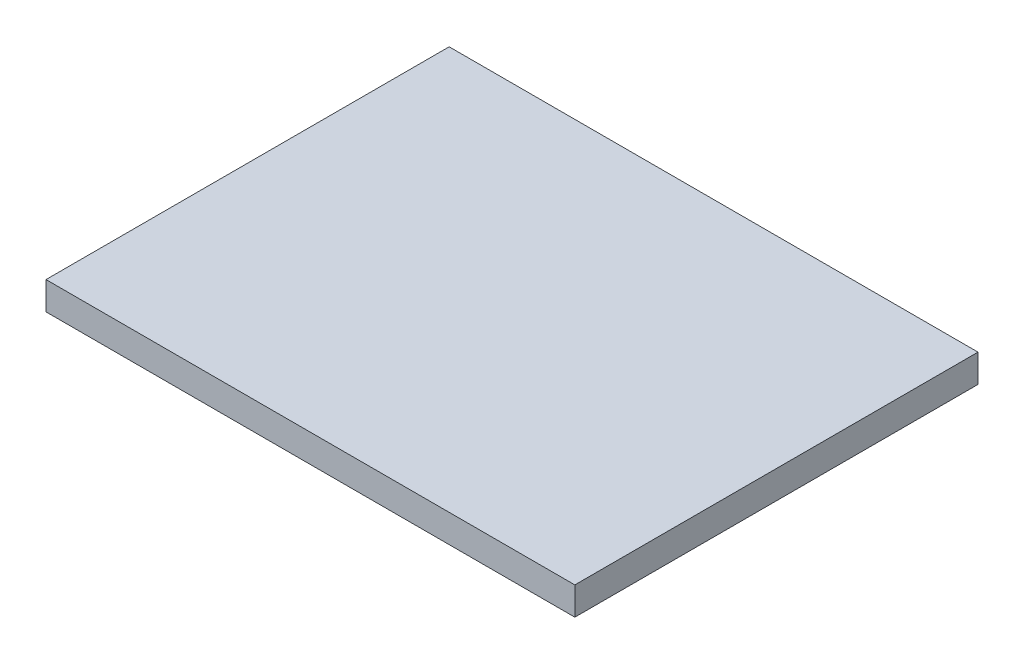
ISO-10303-21;
HEADER;
FILE_DESCRIPTION(('STEP AP214'),'2;1');
FILE_NAME('part.step','',(''),(''),'','','');
FILE_SCHEMA(('AUTOMOTIVE_DESIGN { 1 0 10303 214 1 1 1 1 }'));
ENDSEC;
DATA;
#1=APPLICATION_CONTEXT('core data for automotive mechanical design processes');
#2=APPLICATION_PROTOCOL_DEFINITION('international standard','automotive_design',2000,#1);
#3=PRODUCT_CONTEXT('',#1,'mechanical');
#4=PRODUCT('Part','Part','',(#3));
#5=PRODUCT_RELATED_PRODUCT_CATEGORY('part','',(#4));
#6=PRODUCT_DEFINITION_FORMATION('','',#4);
#7=PRODUCT_DEFINITION_CONTEXT('part definition',#1,'design');
#8=PRODUCT_DEFINITION('design','',#6,#7);
#9=PRODUCT_DEFINITION_SHAPE('','',#8);
#10=(LENGTH_UNIT() NAMED_UNIT(*) SI_UNIT(.MILLI.,.METRE.));
#11=(NAMED_UNIT(*) PLANE_ANGLE_UNIT() SI_UNIT($,.RADIAN.));
#12=(NAMED_UNIT(*) SI_UNIT($,.STERADIAN.) SOLID_ANGLE_UNIT());
#13=UNCERTAINTY_MEASURE_WITH_UNIT(LENGTH_MEASURE(1.E-05),#10,'distance_accuracy_value','');
#14=(GEOMETRIC_REPRESENTATION_CONTEXT(3) GLOBAL_UNCERTAINTY_ASSIGNED_CONTEXT((#13)) GLOBAL_UNIT_ASSIGNED_CONTEXT((#10,
#11,#12)) REPRESENTATION_CONTEXT('',''));
#15=CARTESIAN_POINT('',(0.,0.,0.));
#16=DIRECTION('',(0.,0.,1.));
#17=DIRECTION('',(1.,0.,0.));
#18=AXIS2_PLACEMENT_3D('',#15,#16,#17);
#19=CARTESIAN_POINT('',(-22.5842400577537,2.54,17.2528784703495));
#20=DIRECTION('',(1.,0.,0.));
#21=DIRECTION('',(0.,0.,-1.));
#22=AXIS2_PLACEMENT_3D('',#19,#20,#21);
#23=PLANE('',#22);
#24=DIRECTION('',(0.,0.,1.));
#25=VECTOR('',#24,1.);
#26=CARTESIAN_POINT('',(-22.5842400577537,0.,17.2528784703495));
#27=LINE('',#26,#25);
#28=CARTESIAN_POINT('',(-22.5842400577537,0.,-19.32618575434));
#29=VERTEX_POINT('',#28);
#30=CARTESIAN_POINT('',(-22.5842400577537,0.,17.2528784703495));
#31=VERTEX_POINT('',#30);
#32=EDGE_CURVE('E113',#29,#31,#27,.T.);
#33=ORIENTED_EDGE('',*,*,#32,.T.);
#34=DIRECTION('',(0.,-1.,0.));
#35=VECTOR('',#34,1.);
#36=CARTESIAN_POINT('',(-22.5842400577537,2.54,17.2528784703495));
#37=LINE('',#36,#35);
#38=CARTESIAN_POINT('',(-22.5842400577537,2.54,17.2528784703495));
#39=VERTEX_POINT('',#38);
#40=EDGE_CURVE('E11',#39,#31,#37,.T.);
#41=ORIENTED_EDGE('',*,*,#40,.F.);
#42=DIRECTION('',(0.,0.,1.));
#43=VECTOR('',#42,1.);
#44=CARTESIAN_POINT('',(-22.5842400577537,2.54,17.2528784703495));
#45=LINE('',#44,#43);
#46=CARTESIAN_POINT('',(-22.5842400577537,2.54,-19.32618575434));
#47=VERTEX_POINT('',#46);
#48=EDGE_CURVE('E97',#47,#39,#45,.T.);
#49=ORIENTED_EDGE('',*,*,#48,.F.);
#50=DIRECTION('',(0.,-1.,0.));
#51=VECTOR('',#50,1.);
#52=CARTESIAN_POINT('',(-22.5842400577537,2.54,-19.32618575434));
#53=LINE('',#52,#51);
#54=EDGE_CURVE('E109',#47,#29,#53,.T.);
#55=ORIENTED_EDGE('',*,*,#54,.T.);
#56=EDGE_LOOP('',(#33,#41,#49,#55));
#57=FACE_BOUND('',#56,.T.);
#58=ADVANCED_FACE('F45',(#57),#23,.F.);
#59=CARTESIAN_POINT('',(-22.5842400577537,2.54,17.2528784703495));
#60=DIRECTION('',(0.,0.,-1.));
#61=DIRECTION('',(-1.,0.,0.));
#62=AXIS2_PLACEMENT_3D('',#59,#60,#61);
#63=PLANE('',#62);
#64=DIRECTION('',(1.,0.,0.));
#65=VECTOR('',#64,1.);
#66=CARTESIAN_POINT('',(-22.5842400577537,0.,17.2528784703495));
#67=LINE('',#66,#65);
#68=CARTESIAN_POINT('',(25.3980142288837,0.,17.2528784703495));
#69=VERTEX_POINT('',#68);
#70=EDGE_CURVE('E102',#31,#69,#67,.T.);
#71=ORIENTED_EDGE('',*,*,#70,.T.);
#72=DIRECTION('',(0.,-1.,0.));
#73=VECTOR('',#72,1.);
#74=CARTESIAN_POINT('',(25.3980142288837,2.54,17.2528784703495));
#75=LINE('',#74,#73);
#76=CARTESIAN_POINT('',(25.3980142288837,2.54,17.2528784703495));
#77=VERTEX_POINT('',#76);
#78=EDGE_CURVE('E54',#77,#69,#75,.T.);
#79=ORIENTED_EDGE('',*,*,#78,.F.);
#80=DIRECTION('',(1.,0.,0.));
#81=VECTOR('',#80,1.);
#82=CARTESIAN_POINT('',(-22.5842400577537,2.54,17.2528784703495));
#83=LINE('',#82,#81);
#84=EDGE_CURVE('E92',#39,#77,#83,.T.);
#85=ORIENTED_EDGE('',*,*,#84,.F.);
#86=ORIENTED_EDGE('',*,*,#40,.T.);
#87=EDGE_LOOP('',(#71,#79,#85,#86));
#88=FACE_BOUND('',#87,.T.);
#89=ADVANCED_FACE('F101',(#88),#63,.F.);
#90=CARTESIAN_POINT('',(25.3980142288837,2.54,17.2528784703495));
#91=DIRECTION('',(-1.,0.,0.));
#92=DIRECTION('',(0.,0.,1.));
#93=AXIS2_PLACEMENT_3D('',#90,#91,#92);
#94=PLANE('',#93);
#95=DIRECTION('',(0.,0.,-1.));
#96=VECTOR('',#95,1.);
#97=CARTESIAN_POINT('',(25.3980142288837,0.,17.2528784703495));
#98=LINE('',#97,#96);
#99=CARTESIAN_POINT('',(25.3980142288837,0.,-19.32618575434));
#100=VERTEX_POINT('',#99);
#101=EDGE_CURVE('E79',#69,#100,#98,.T.);
#102=ORIENTED_EDGE('',*,*,#101,.T.);
#103=DIRECTION('',(0.,-1.,0.));
#104=VECTOR('',#103,1.);
#105=CARTESIAN_POINT('',(25.3980142288837,2.54,-19.32618575434));
#106=LINE('',#105,#104);
#107=CARTESIAN_POINT('',(25.3980142288837,2.54,-19.32618575434));
#108=VERTEX_POINT('',#107);
#109=EDGE_CURVE('E104',#108,#100,#106,.T.);
#110=ORIENTED_EDGE('',*,*,#109,.F.);
#111=DIRECTION('',(0.,0.,-1.));
#112=VECTOR('',#111,1.);
#113=CARTESIAN_POINT('',(25.3980142288837,2.54,17.2528784703495));
#114=LINE('',#113,#112);
#115=EDGE_CURVE('E95',#77,#108,#114,.T.);
#116=ORIENTED_EDGE('',*,*,#115,.F.);
#117=ORIENTED_EDGE('',*,*,#78,.T.);
#118=EDGE_LOOP('',(#102,#110,#116,#117));
#119=FACE_BOUND('',#118,.T.);
#120=ADVANCED_FACE('F105',(#119),#94,.F.);
#121=CARTESIAN_POINT('',(-22.5842400577537,2.54,-19.32618575434));
#122=DIRECTION('',(0.,0.,1.));
#123=DIRECTION('',(1.,0.,0.));
#124=AXIS2_PLACEMENT_3D('',#121,#122,#123);
#125=PLANE('',#124);
#126=DIRECTION('',(-1.,0.,0.));
#127=VECTOR('',#126,1.);
#128=CARTESIAN_POINT('',(-22.5842400577537,0.,-19.32618575434));
#129=LINE('',#128,#127);
#130=EDGE_CURVE('E85',#100,#29,#129,.T.);
#131=ORIENTED_EDGE('',*,*,#130,.T.);
#132=ORIENTED_EDGE('',*,*,#54,.F.);
#133=DIRECTION('',(-1.,0.,0.));
#134=VECTOR('',#133,1.);
#135=CARTESIAN_POINT('',(-22.5842400577537,2.54,-19.32618575434));
#136=LINE('',#135,#134);
#137=EDGE_CURVE('E62',#108,#47,#136,.T.);
#138=ORIENTED_EDGE('',*,*,#137,.F.);
#139=ORIENTED_EDGE('',*,*,#109,.T.);
#140=EDGE_LOOP('',(#131,#132,#138,#139));
#141=FACE_BOUND('',#140,.T.);
#142=ADVANCED_FACE('F126',(#141),#125,.F.);
#143=CARTESIAN_POINT('',(0.,2.54,0.));
#144=DIRECTION('',(0.,-1.,0.));
#145=DIRECTION('',(0.,0.,-1.));
#146=AXIS2_PLACEMENT_3D('',#143,#144,#145);
#147=PLANE('',#146);
#148=ORIENTED_EDGE('',*,*,#48,.T.);
#149=ORIENTED_EDGE('',*,*,#84,.T.);
#150=ORIENTED_EDGE('',*,*,#115,.T.);
#151=ORIENTED_EDGE('',*,*,#137,.T.);
#152=EDGE_LOOP('',(#148,#149,#150,#151));
#153=FACE_BOUND('',#152,.T.);
#154=ADVANCED_FACE('F93',(#153),#147,.F.);
#155=CARTESIAN_POINT('',(0.,0.,0.));
#156=DIRECTION('',(0.,-1.,0.));
#157=DIRECTION('',(0.,0.,-1.));
#158=AXIS2_PLACEMENT_3D('',#155,#156,#157);
#159=PLANE('',#158);
#160=ORIENTED_EDGE('',*,*,#32,.F.);
#161=ORIENTED_EDGE('',*,*,#130,.F.);
#162=ORIENTED_EDGE('',*,*,#101,.F.);
#163=ORIENTED_EDGE('',*,*,#70,.F.);
#164=EDGE_LOOP('',(#160,#161,#162,#163));
#165=FACE_BOUND('',#164,.T.);
#166=ADVANCED_FACE('F129',(#165),#159,.T.);
#167=CLOSED_SHELL('',(#58,#89,#120,#142,#154,#166));
#168=MANIFOLD_SOLID_BREP('B2',#167);
#169=ADVANCED_BREP_SHAPE_REPRESENTATION('',(#18,#168),#14);
#170=SHAPE_DEFINITION_REPRESENTATION(#9,#169);
ENDSEC;
END-ISO-10303-21;
